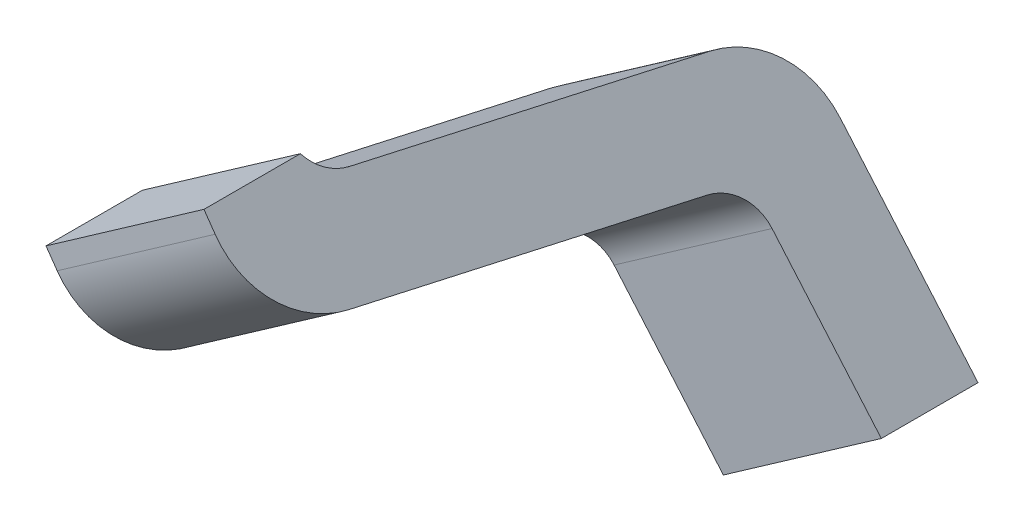
ISO-10303-21;
HEADER;
FILE_DESCRIPTION(('STEP AP214'),'2;1');
FILE_NAME('part.step','',(''),(''),'','','');
FILE_SCHEMA(('AUTOMOTIVE_DESIGN { 1 0 10303 214 1 1 1 1 }'));
ENDSEC;
DATA;
#1=APPLICATION_CONTEXT('core data for automotive mechanical design processes');
#2=APPLICATION_PROTOCOL_DEFINITION('international standard','automotive_design',2000,#1);
#3=PRODUCT_CONTEXT('',#1,'mechanical');
#4=PRODUCT('Part','Part','',(#3));
#5=PRODUCT_RELATED_PRODUCT_CATEGORY('part','',(#4));
#6=PRODUCT_DEFINITION_FORMATION('','',#4);
#7=PRODUCT_DEFINITION_CONTEXT('part definition',#1,'design');
#8=PRODUCT_DEFINITION('design','',#6,#7);
#9=PRODUCT_DEFINITION_SHAPE('','',#8);
#10=(LENGTH_UNIT() NAMED_UNIT(*) SI_UNIT(.MILLI.,.METRE.));
#11=(NAMED_UNIT(*) PLANE_ANGLE_UNIT() SI_UNIT($,.RADIAN.));
#12=(NAMED_UNIT(*) SI_UNIT($,.STERADIAN.) SOLID_ANGLE_UNIT());
#13=UNCERTAINTY_MEASURE_WITH_UNIT(LENGTH_MEASURE(1.E-05),#10,'distance_accuracy_value','');
#14=(GEOMETRIC_REPRESENTATION_CONTEXT(3) GLOBAL_UNCERTAINTY_ASSIGNED_CONTEXT((#13)) GLOBAL_UNIT_ASSIGNED_CONTEXT((#10,
#11,#12)) REPRESENTATION_CONTEXT('',''));
#15=CARTESIAN_POINT('',(0.,0.,0.));
#16=DIRECTION('',(0.,0.,1.));
#17=DIRECTION('',(1.,0.,0.));
#18=AXIS2_PLACEMENT_3D('',#15,#16,#17);
#19=CARTESIAN_POINT('',(-18.59130634383,-13.82973925178,0.362554628123));
#20=DIRECTION('',(0.819152022341012,0.573576467696008,0.));
#21=DIRECTION('',(-0.573576467696008,0.819152022341012,0.));
#22=AXIS2_PLACEMENT_3D('',#19,#20,#21);
#23=PLANE('',#22);
#24=DIRECTION('',(0.,0.,1.));
#25=VECTOR('',#24,1.);
#26=CARTESIAN_POINT('',(-18.3830334239287,-14.1271837829719,0.150366284712));
#27=LINE('',#26,#25);
#28=CARTESIAN_POINT('',(-18.3830334239296,-14.1271837829706,1.70028876322776E-13));
#29=VERTEX_POINT('',#28);
#30=CARTESIAN_POINT('',(-18.3830334239287,-14.1271837829719,0.150366284711992));
#31=VERTEX_POINT('',#30);
#32=EDGE_CURVE('E135',#29,#31,#27,.T.);
#33=ORIENTED_EDGE('',*,*,#32,.F.);
#34=DIRECTION('',(0.572179264243875,-0.817156609188302,-0.0697564737441169));
#35=VECTOR('',#34,1.);
#36=CARTESIAN_POINT('',(-18.57408751915,-13.85433027992,0.0232921058309044));
#37=LINE('',#36,#35);
#38=CARTESIAN_POINT('',(-18.5740875191528,-13.854330279919,0.0232921058310202));
#39=VERTEX_POINT('',#38);
#40=EDGE_CURVE('E128',#39,#29,#37,.T.);
#41=ORIENTED_EDGE('',*,*,#40,.F.);
#42=CARTESIAN_POINT('',(-18.5680859183842,-13.8629014533988,0.17292671337));
#43=DIRECTION('',(0.819152022341012,0.573576467696008,0.));
#44=DIRECTION('',(-0.573576467696008,0.819152022341012,0.));
#45=AXIS2_PLACEMENT_3D('',#42,#43,#44);
#46=CIRCLE('',#45,0.15);
#47=CARTESIAN_POINT('',(-18.6528153012337,-13.7418953640217,0.146879486720041));
#48=VERTEX_POINT('',#47);
#49=EDGE_CURVE('E166',#48,#39,#46,.F.);
#50=ORIENTED_EDGE('',*,*,#49,.F.);
#51=DIRECTION('',(-0.0996005083680711,0.142244255911819,0.984807753012188));
#52=VECTOR('',#51,1.);
#53=CARTESIAN_POINT('',(-18.6411428343955,-13.7585653729098,0.03146706537458));
#54=LINE('',#53,#52);
#55=CARTESIAN_POINT('',(-18.7043244664925,-13.6683326583164,0.656180354065801));
#56=VERTEX_POINT('',#55);
#57=EDGE_CURVE('E88',#56,#48,#54,.F.);
#58=ORIENTED_EDGE('',*,*,#57,.F.);
#59=CARTESIAN_POINT('',(-18.7466891579166,-13.6078296136304,0.643156740741));
#60=DIRECTION('',(0.819152022341012,0.573576467696008,0.));
#61=DIRECTION('',(-0.573576467696008,0.819152022341012,0.));
#62=AXIS2_PLACEMENT_3D('',#59,#60,#61);
#63=CIRCLE('',#62,0.075);
#64=CARTESIAN_POINT('',(-18.7271793045483,-13.6356925695616,0.709999999999843));
#65=VERTEX_POINT('',#64);
#66=EDGE_CURVE('E20',#56,#65,#63,.F.);
#67=ORIENTED_EDGE('',*,*,#66,.T.);
#68=DIRECTION('',(0.,0.,1.));
#69=VECTOR('',#68,1.);
#70=CARTESIAN_POINT('',(-18.7271793045487,-13.6356925695619,0.71));
#71=LINE('',#70,#69);
#72=CARTESIAN_POINT('',(-18.7271793045496,-13.6356925695606,0.86));
#73=VERTEX_POINT('',#72);
#74=EDGE_CURVE('E94',#73,#65,#71,.F.);
#75=ORIENTED_EDGE('',*,*,#74,.F.);
#76=DIRECTION('',(-0.573576467531405,0.819152022456269,0.));
#77=VECTOR('',#76,1.);
#78=CARTESIAN_POINT('',(-18.70976762439,-13.66055902386,0.86));
#79=LINE('',#78,#77);
#80=CARTESIAN_POINT('',(-18.7097676243906,-13.6605590238568,0.86));
#81=VERTEX_POINT('',#80);
#82=EDGE_CURVE('E100',#81,#73,#79,.T.);
#83=ORIENTED_EDGE('',*,*,#82,.F.);
#84=CARTESIAN_POINT('',(-18.7097676243911,-13.6605590238536,0.71));
#85=DIRECTION('',(0.819152022341012,0.573576467696008,0.));
#86=DIRECTION('',(-0.573576467696008,0.819152022341012,0.));
#87=AXIS2_PLACEMENT_3D('',#84,#85,#86);
#88=CIRCLE('',#87,0.15);
#89=CARTESIAN_POINT('',(-18.6250382415399,-13.7815651132305,0.736047226650314));
#90=VERTEX_POINT('',#89);
#91=EDGE_CURVE('E116',#90,#81,#88,.F.);
#92=ORIENTED_EDGE('',*,*,#91,.F.);
#93=DIRECTION('',(-0.0996005083680711,0.142244255911819,0.984807753012188));
#94=VECTOR('',#93,1.);
#95=CARTESIAN_POINT('',(-18.6375744540155,-13.7636615478298,0.86));
#96=LINE('',#95,#94);
#97=CARTESIAN_POINT('',(-18.5739221518036,-13.8545664489549,0.23063292404198));
#98=VERTEX_POINT('',#97);
#99=EDGE_CURVE('E146',#98,#90,#96,.T.);
#100=ORIENTED_EDGE('',*,*,#99,.F.);
#101=CARTESIAN_POINT('',(-18.5315574603788,-13.915069493642,0.243656537367));
#102=DIRECTION('',(0.819152022341012,0.573576467696008,0.));
#103=DIRECTION('',(-0.573576467696008,0.819152022341012,0.));
#104=AXIS2_PLACEMENT_3D('',#101,#102,#103);
#105=CIRCLE('',#104,0.075);
#106=CARTESIAN_POINT('',(-18.5345582607622,-13.9107839069008,0.168839233598056));
#107=VERTEX_POINT('',#106);
#108=EDGE_CURVE('E168',#98,#107,#105,.F.);
#109=ORIENTED_EDGE('',*,*,#108,.T.);
#110=DIRECTION('',(-0.572179264242681,0.817156609189138,0.0697564737441169));
#111=VECTOR('',#110,1.);
#112=CARTESIAN_POINT('',(-18.38303342393,-14.12718378297,0.150366284712135));
#113=LINE('',#112,#111);
#114=EDGE_CURVE('E138',#31,#107,#113,.T.);
#115=ORIENTED_EDGE('',*,*,#114,.F.);
#116=EDGE_LOOP('',(#33,#41,#50,#58,#67,#75,#83,#92,#100,#109,#115));
#117=FACE_BOUND('',#116,.T.);
#118=ADVANCED_FACE('F17',(#117),#23,.T.);
#119=CARTESIAN_POINT('',(-18.8868884411,-13.93063831322,0.03146706537458));
#120=DIRECTION('',(-0.564862552332143,0.806707262497204,-0.173648177667044));
#121=DIRECTION('',(-0.819152022341176,-0.573576467695774,0.));
#122=AXIS2_PLACEMENT_3D('',#119,#120,#121);
#123=PLANE('',#122);
#124=DIRECTION('',(0.819152022341012,0.573576467696008,0.));
#125=VECTOR('',#124,1.);
#126=CARTESIAN_POINT('',(-18.8985609079399,-13.9139683043353,0.146879486720775));
#127=LINE('',#126,#125);
#128=CARTESIAN_POINT('',(-18.8985609079385,-13.9139683043303,0.146879486720418));
#129=VERTEX_POINT('',#128);
#130=EDGE_CURVE('E190',#129,#48,#127,.T.);
#131=ORIENTED_EDGE('',*,*,#130,.F.);
#132=DIRECTION('',(-0.0996005083632167,0.142244255904802,0.984807753013693));
#133=VECTOR('',#132,1.);
#134=CARTESIAN_POINT('',(-18.8985609079364,-13.9139683043275,0.14687948672));
#135=LINE('',#134,#133);
#136=CARTESIAN_POINT('',(-18.9500700731942,-13.8404055986262,0.656180354065669));
#137=VERTEX_POINT('',#136);
#138=EDGE_CURVE('E165',#129,#137,#135,.T.);
#139=ORIENTED_EDGE('',*,*,#138,.T.);
#140=DIRECTION('',(0.819152022341012,0.573576467696008,0.));
#141=VECTOR('',#140,1.);
#142=CARTESIAN_POINT('',(-18.9500700731951,-13.8404055986273,0.656180354066103));
#143=LINE('',#142,#141);
#144=EDGE_CURVE('E124',#137,#56,#143,.T.);
#145=ORIENTED_EDGE('',*,*,#144,.T.);
#146=ORIENTED_EDGE('',*,*,#57,.T.);
#147=EDGE_LOOP('',(#131,#139,#145,#146));
#148=FACE_BOUND('',#147,.T.);
#149=ADVANCED_FACE('F231',(#148),#123,.T.);
#150=CARTESIAN_POINT('',(-18.99243476462,-13.77990255394,0.643156740741));
#151=DIRECTION('',(0.819152022341012,0.573576467696008,0.));
#152=DIRECTION('',(-0.573576467696008,0.819152022341012,0.));
#153=AXIS2_PLACEMENT_3D('',#150,#151,#152);
#154=CYLINDRICAL_SURFACE('',#153,0.075);
#155=ORIENTED_EDGE('',*,*,#144,.F.);
#156=CARTESIAN_POINT('',(-18.9924347646186,-13.779902553939,0.643156740741));
#157=DIRECTION('',(0.819152022341012,0.573576467696008,0.));
#158=DIRECTION('',(-0.573576467696008,0.819152022341012,0.));
#159=AXIS2_PLACEMENT_3D('',#156,#157,#158);
#160=CIRCLE('',#159,0.075);
#161=CARTESIAN_POINT('',(-18.9729249112503,-13.8077655098702,0.709999999999843));
#162=VERTEX_POINT('',#161);
#163=EDGE_CURVE('E162',#137,#162,#160,.F.);
#164=ORIENTED_EDGE('',*,*,#163,.T.);
#165=DIRECTION('',(-0.819152022341012,-0.573576467696008,0.));
#166=VECTOR('',#165,1.);
#167=CARTESIAN_POINT('',(-18.97292491125,-13.80776550987,0.71));
#168=LINE('',#167,#166);
#169=EDGE_CURVE('E107',#65,#162,#168,.T.);
#170=ORIENTED_EDGE('',*,*,#169,.F.);
#171=ORIENTED_EDGE('',*,*,#66,.F.);
#172=EDGE_LOOP('',(#155,#164,#170,#171));
#173=FACE_BOUND('',#172,.T.);
#174=ADVANCED_FACE('F234',(#173),#154,.F.);
#175=CARTESIAN_POINT('',(-18.97292491125,-13.80776550987,0.71));
#176=DIRECTION('',(-0.573576467696008,0.819152022341012,0.));
#177=DIRECTION('',(-0.819152022341012,-0.573576467696008,0.));
#178=AXIS2_PLACEMENT_3D('',#175,#176,#177);
#179=PLANE('',#178);
#180=ORIENTED_EDGE('',*,*,#74,.T.);
#181=ORIENTED_EDGE('',*,*,#169,.T.);
#182=DIRECTION('',(0.,0.,1.));
#183=VECTOR('',#182,1.);
#184=CARTESIAN_POINT('',(-18.9729249112505,-13.8077655098704,0.362554628123));
#185=LINE('',#184,#183);
#186=CARTESIAN_POINT('',(-18.9729249112505,-13.8077655098704,0.86));
#187=VERTEX_POINT('',#186);
#188=EDGE_CURVE('E115',#162,#187,#185,.T.);
#189=ORIENTED_EDGE('',*,*,#188,.T.);
#190=DIRECTION('',(-0.819152022336611,-0.573576467702294,0.));
#191=VECTOR('',#190,1.);
#192=CARTESIAN_POINT('',(-18.72717930455,-13.63569256956,0.86));
#193=LINE('',#192,#191);
#194=EDGE_CURVE('E103',#73,#187,#193,.T.);
#195=ORIENTED_EDGE('',*,*,#194,.F.);
#196=EDGE_LOOP('',(#180,#181,#189,#195));
#197=FACE_BOUND('',#196,.T.);
#198=ADVANCED_FACE('F113',(#197),#179,.T.);
#199=CARTESIAN_POINT('',(-18.97292491125,-13.80776550987,0.86));
#200=DIRECTION('',(0.,0.,1.));
#201=DIRECTION('',(0.,-1.,0.));
#202=AXIS2_PLACEMENT_3D('',#199,#200,#201);
#203=PLANE('',#202);
#204=ORIENTED_EDGE('',*,*,#194,.T.);
#205=DIRECTION('',(-0.573576467696008,0.819152022341012,0.));
#206=VECTOR('',#205,1.);
#207=CARTESIAN_POINT('',(-18.83705195053,-14.00181219209,0.86));
#208=LINE('',#207,#206);
#209=CARTESIAN_POINT('',(-18.9555132310884,-13.8326319641625,0.86));
#210=VERTEX_POINT('',#209);
#211=EDGE_CURVE('E161',#187,#210,#208,.F.);
#212=ORIENTED_EDGE('',*,*,#211,.T.);
#213=DIRECTION('',(0.819152022341012,0.573576467696008,0.));
#214=VECTOR('',#213,1.);
#215=CARTESIAN_POINT('',(-18.9555132310866,-13.8326319641648,0.86));
#216=LINE('',#215,#214);
#217=EDGE_CURVE('E105',#81,#210,#216,.F.);
#218=ORIENTED_EDGE('',*,*,#217,.F.);
#219=ORIENTED_EDGE('',*,*,#82,.T.);
#220=EDGE_LOOP('',(#204,#212,#218,#219));
#221=FACE_BOUND('',#220,.T.);
#222=ADVANCED_FACE('F101',(#221),#203,.T.);
#223=CARTESIAN_POINT('',(-18.95551323109,-13.83263196416,0.71));
#224=DIRECTION('',(0.819152022341012,0.573576467696008,0.));
#225=DIRECTION('',(-0.573576467696008,0.819152022341012,0.));
#226=AXIS2_PLACEMENT_3D('',#223,#224,#225);
#227=CYLINDRICAL_SURFACE('',#226,0.15);
#228=CARTESIAN_POINT('',(-18.95551323109,-13.83263196416,0.71));
#229=DIRECTION('',(0.819152022341012,0.573576467696008,0.));
#230=DIRECTION('',(-0.573576467696008,0.819152022341012,0.));
#231=AXIS2_PLACEMENT_3D('',#228,#229,#230);
#232=CIRCLE('',#231,0.15);
#233=CARTESIAN_POINT('',(-18.8707838482381,-13.9536380535375,0.736047226650226));
#234=VERTEX_POINT('',#233);
#235=EDGE_CURVE('E158',#210,#234,#232,.T.);
#236=ORIENTED_EDGE('',*,*,#235,.T.);
#237=DIRECTION('',(0.819152022341176,0.573576467695774,0.));
#238=VECTOR('',#237,1.);
#239=CARTESIAN_POINT('',(-18.8707838482445,-13.9536380535409,0.736047226650095));
#240=LINE('',#239,#238);
#241=EDGE_CURVE('E147',#90,#234,#240,.F.);
#242=ORIENTED_EDGE('',*,*,#241,.F.);
#243=ORIENTED_EDGE('',*,*,#91,.T.);
#244=ORIENTED_EDGE('',*,*,#217,.T.);
#245=EDGE_LOOP('',(#236,#242,#243,#244));
#246=FACE_BOUND('',#245,.T.);
#247=ADVANCED_FACE('F240',(#246),#227,.T.);
#248=CARTESIAN_POINT('',(-18.88332006072,-13.93573448814,0.86));
#249=DIRECTION('',(0.564862552332143,-0.806707262497204,0.173648177667044));
#250=DIRECTION('',(0.819152022341176,0.573576467695774,0.));
#251=AXIS2_PLACEMENT_3D('',#248,#249,#250);
#252=PLANE('',#251);
#253=ORIENTED_EDGE('',*,*,#241,.T.);
#254=DIRECTION('',(0.0996005083662944,-0.142244255909203,-0.984807753012746));
#255=VECTOR('',#254,1.);
#256=CARTESIAN_POINT('',(-18.8707838482378,-13.9536380535384,0.73604722665));
#257=LINE('',#256,#255);
#258=CARTESIAN_POINT('',(-18.8196677585016,-14.0266393892609,0.23063292404213));
#259=VERTEX_POINT('',#258);
#260=EDGE_CURVE('E157',#234,#259,#257,.T.);
#261=ORIENTED_EDGE('',*,*,#260,.T.);
#262=DIRECTION('',(0.819152022341012,0.573576467696008,0.));
#263=VECTOR('',#262,1.);
#264=CARTESIAN_POINT('',(-18.8196677585049,-14.0266393892627,0.230632924041897));
#265=LINE('',#264,#263);
#266=EDGE_CURVE('E169',#259,#98,#265,.T.);
#267=ORIENTED_EDGE('',*,*,#266,.T.);
#268=ORIENTED_EDGE('',*,*,#99,.T.);
#269=EDGE_LOOP('',(#253,#261,#267,#268));
#270=FACE_BOUND('',#269,.T.);
#271=ADVANCED_FACE('F243',(#270),#252,.T.);
#272=CARTESIAN_POINT('',(-18.77730306708,-14.08714243395,0.243656537367));
#273=DIRECTION('',(0.819152022341012,0.573576467696008,0.));
#274=DIRECTION('',(-0.573576467696008,0.819152022341012,0.));
#275=AXIS2_PLACEMENT_3D('',#272,#273,#274);
#276=CYLINDRICAL_SURFACE('',#275,0.075);
#277=DIRECTION('',(-0.819152022336631,-0.573576467702265,-5.67037736212191E-13));
#278=VECTOR('',#277,1.);
#279=CARTESIAN_POINT('',(-18.53455826076,-13.9107839069,0.168839233598012));
#280=LINE('',#279,#278);
#281=CARTESIAN_POINT('',(-18.7803038674616,-14.0828568472089,0.168839233598086));
#282=VERTEX_POINT('',#281);
#283=EDGE_CURVE('E143',#107,#282,#280,.T.);
#284=ORIENTED_EDGE('',*,*,#283,.F.);
#285=ORIENTED_EDGE('',*,*,#108,.F.);
#286=ORIENTED_EDGE('',*,*,#266,.F.);
#287=CARTESIAN_POINT('',(-18.7773030670764,-14.0871424339475,0.243656537367));
#288=DIRECTION('',(0.819152022341012,0.573576467696008,0.));
#289=DIRECTION('',(-0.573576467696008,0.819152022341012,0.));
#290=AXIS2_PLACEMENT_3D('',#287,#288,#289);
#291=CIRCLE('',#290,0.075);
#292=EDGE_CURVE('E153',#259,#282,#291,.F.);
#293=ORIENTED_EDGE('',*,*,#292,.T.);
#294=EDGE_LOOP('',(#284,#285,#286,#293));
#295=FACE_BOUND('',#294,.T.);
#296=ADVANCED_FACE('F242',(#295),#276,.F.);
#297=CARTESIAN_POINT('',(-18.81383152509,-14.03497439371,0.17292671337));
#298=DIRECTION('',(0.040010671809053,-0.05714115653889,0.997564050259825));
#299=DIRECTION('',(0.,-0.998363487353977,-0.0571869488467904));
#300=AXIS2_PLACEMENT_3D('',#297,#298,#299);
#301=PLANE('',#300);
#302=DIRECTION('',(0.819152022341012,0.573576467696008,0.));
#303=VECTOR('',#302,1.);
#304=CARTESIAN_POINT('',(-18.62877903063,-14.29925672328,0.150366284712));
#305=LINE('',#304,#303);
#306=CARTESIAN_POINT('',(-18.6287790306296,-14.2992567232797,0.150366284712));
#307=VERTEX_POINT('',#306);
#308=EDGE_CURVE('E132',#31,#307,#305,.F.);
#309=ORIENTED_EDGE('',*,*,#308,.F.);
#310=ORIENTED_EDGE('',*,*,#114,.T.);
#311=ORIENTED_EDGE('',*,*,#283,.T.);
#312=DIRECTION('',(0.572179264248537,-0.817156609184998,-0.0697564737445809));
#313=VECTOR('',#312,1.);
#314=CARTESIAN_POINT('',(-18.7803038674611,-14.0828568472108,0.168839233598));
#315=LINE('',#314,#313);
#316=EDGE_CURVE('E156',#282,#307,#315,.T.);
#317=ORIENTED_EDGE('',*,*,#316,.T.);
#318=EDGE_LOOP('',(#309,#310,#311,#317));
#319=FACE_BOUND('',#318,.T.);
#320=ADVANCED_FACE('F223',(#319),#301,.T.);
#321=CARTESIAN_POINT('',(-18.62877903063,-14.29925672328,0.150366284712));
#322=DIRECTION('',(0.573576467696008,-0.819152022341012,0.));
#323=DIRECTION('',(0.819152022341012,0.573576467696008,0.));
#324=AXIS2_PLACEMENT_3D('',#321,#322,#323);
#325=PLANE('',#324);
#326=ORIENTED_EDGE('',*,*,#32,.T.);
#327=ORIENTED_EDGE('',*,*,#308,.T.);
#328=DIRECTION('',(0.,0.,1.));
#329=VECTOR('',#328,1.);
#330=CARTESIAN_POINT('',(-18.6287790306296,-14.2992567232797,0.362554628123));
#331=LINE('',#330,#329);
#332=CARTESIAN_POINT('',(-18.6287790306296,-14.2992567232797,0.));
#333=VERTEX_POINT('',#332);
#334=EDGE_CURVE('E184',#307,#333,#331,.F.);
#335=ORIENTED_EDGE('',*,*,#334,.T.);
#336=DIRECTION('',(-0.819152022336634,-0.573576467702261,-5.6676668566907E-13));
#337=VECTOR('',#336,1.);
#338=CARTESIAN_POINT('',(-18.38303342393,-14.12718378297,1.70030005700039E-13));
#339=LINE('',#338,#337);
#340=EDGE_CURVE('E131',#29,#333,#339,.T.);
#341=ORIENTED_EDGE('',*,*,#340,.F.);
#342=EDGE_LOOP('',(#326,#327,#335,#341));
#343=FACE_BOUND('',#342,.T.);
#344=ADVANCED_FACE('F219',(#343),#325,.T.);
#345=CARTESIAN_POINT('',(-18.62877903063,-14.29925672328,0.));
#346=DIRECTION('',(-0.040010671809053,0.05714115653889,-0.997564050259825));
#347=DIRECTION('',(0.,0.998363487353977,0.0571869488467904));
#348=AXIS2_PLACEMENT_3D('',#345,#346,#347);
#349=PLANE('',#348);
#350=ORIENTED_EDGE('',*,*,#340,.T.);
#351=DIRECTION('',(-0.572179264248599,0.817156609185088,0.0697564737430286));
#352=VECTOR('',#351,1.);
#353=CARTESIAN_POINT('',(-18.6287790306296,-14.2992567232797,0.));
#354=LINE('',#353,#352);
#355=CARTESIAN_POINT('',(-18.8198331258566,-14.0264032202289,0.0232921058307347));
#356=VERTEX_POINT('',#355);
#357=EDGE_CURVE('E26',#333,#356,#354,.T.);
#358=ORIENTED_EDGE('',*,*,#357,.T.);
#359=DIRECTION('',(0.819152022341012,0.573576467696008,0.));
#360=VECTOR('',#359,1.);
#361=CARTESIAN_POINT('',(-18.8198331258586,-14.0264032202332,0.0232921058306846));
#362=LINE('',#361,#360);
#363=EDGE_CURVE('E34',#39,#356,#362,.F.);
#364=ORIENTED_EDGE('',*,*,#363,.F.);
#365=ORIENTED_EDGE('',*,*,#40,.T.);
#366=EDGE_LOOP('',(#350,#358,#364,#365));
#367=FACE_BOUND('',#366,.T.);
#368=ADVANCED_FACE('F212',(#367),#349,.T.);
#369=CARTESIAN_POINT('',(-18.81383152509,-14.03497439371,0.17292671337));
#370=DIRECTION('',(0.819152022341012,0.573576467696008,0.));
#371=DIRECTION('',(-0.573576467696008,0.819152022341012,0.));
#372=AXIS2_PLACEMENT_3D('',#369,#370,#371);
#373=CYLINDRICAL_SURFACE('',#372,0.15);
#374=CARTESIAN_POINT('',(-18.8138315250895,-14.0349743937096,0.17292671337));
#375=DIRECTION('',(0.819152022341012,0.573576467696008,0.));
#376=DIRECTION('',(-0.573576467696008,0.819152022341012,0.));
#377=AXIS2_PLACEMENT_3D('',#374,#375,#376);
#378=CIRCLE('',#377,0.15);
#379=EDGE_CURVE('E11',#356,#129,#378,.T.);
#380=ORIENTED_EDGE('',*,*,#379,.T.);
#381=ORIENTED_EDGE('',*,*,#130,.T.);
#382=ORIENTED_EDGE('',*,*,#49,.T.);
#383=ORIENTED_EDGE('',*,*,#363,.T.);
#384=EDGE_LOOP('',(#380,#381,#382,#383));
#385=FACE_BOUND('',#384,.T.);
#386=ADVANCED_FACE('F228',(#385),#373,.T.);
#387=CARTESIAN_POINT('',(-18.83705195053,-14.00181219209,0.362554628123));
#388=DIRECTION('',(0.819152022341012,0.573576467696008,0.));
#389=DIRECTION('',(-0.573576467696008,0.819152022341012,0.));
#390=AXIS2_PLACEMENT_3D('',#387,#388,#389);
#391=PLANE('',#390);
#392=ORIENTED_EDGE('',*,*,#357,.F.);
#393=ORIENTED_EDGE('',*,*,#334,.F.);
#394=ORIENTED_EDGE('',*,*,#316,.F.);
#395=ORIENTED_EDGE('',*,*,#292,.F.);
#396=ORIENTED_EDGE('',*,*,#260,.F.);
#397=ORIENTED_EDGE('',*,*,#235,.F.);
#398=ORIENTED_EDGE('',*,*,#211,.F.);
#399=ORIENTED_EDGE('',*,*,#188,.F.);
#400=ORIENTED_EDGE('',*,*,#163,.F.);
#401=ORIENTED_EDGE('',*,*,#138,.F.);
#402=ORIENTED_EDGE('',*,*,#379,.F.);
#403=EDGE_LOOP('',(#392,#393,#394,#395,#396,#397,#398,#399,#400,#401,#402));
#404=FACE_BOUND('',#403,.T.);
#405=ADVANCED_FACE('F216',(#404),#391,.F.);
#406=CLOSED_SHELL('',(#118,#149,#174,#198,#222,#247,#271,#296,#320,#344,#368,#386,#405));
#407=MANIFOLD_SOLID_BREP('B1',#406);
#408=ADVANCED_BREP_SHAPE_REPRESENTATION('',(#18,#407),#14);
#409=SHAPE_DEFINITION_REPRESENTATION(#9,#408);
ENDSEC;
END-ISO-10303-21;
